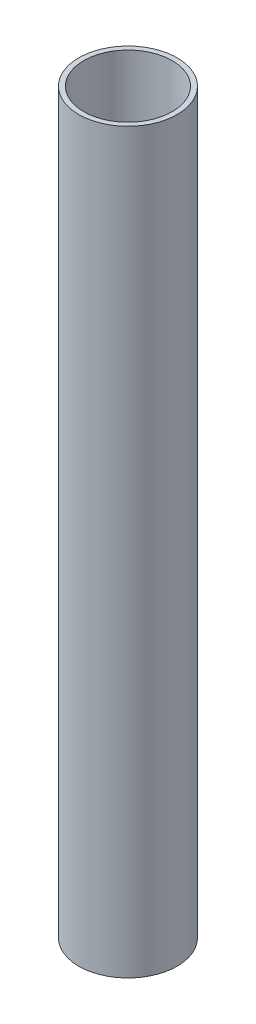
ISO-10303-21;
HEADER;
FILE_DESCRIPTION(('STEP AP214'),'2;1');
FILE_NAME('part.step','',(''),(''),'','','');
FILE_SCHEMA(('AUTOMOTIVE_DESIGN { 1 0 10303 214 1 1 1 1 }'));
ENDSEC;
DATA;
#1=APPLICATION_CONTEXT('core data for automotive mechanical design processes');
#2=APPLICATION_PROTOCOL_DEFINITION('international standard','automotive_design',2000,#1);
#3=PRODUCT_CONTEXT('',#1,'mechanical');
#4=PRODUCT('Part','Part','',(#3));
#5=PRODUCT_RELATED_PRODUCT_CATEGORY('part','',(#4));
#6=PRODUCT_DEFINITION_FORMATION('','',#4);
#7=PRODUCT_DEFINITION_CONTEXT('part definition',#1,'design');
#8=PRODUCT_DEFINITION('design','',#6,#7);
#9=PRODUCT_DEFINITION_SHAPE('','',#8);
#10=(LENGTH_UNIT() NAMED_UNIT(*) SI_UNIT(.MILLI.,.METRE.));
#11=(NAMED_UNIT(*) PLANE_ANGLE_UNIT() SI_UNIT($,.RADIAN.));
#12=(NAMED_UNIT(*) SI_UNIT($,.STERADIAN.) SOLID_ANGLE_UNIT());
#13=UNCERTAINTY_MEASURE_WITH_UNIT(LENGTH_MEASURE(1.E-05),#10,'distance_accuracy_value','');
#14=(GEOMETRIC_REPRESENTATION_CONTEXT(3) GLOBAL_UNCERTAINTY_ASSIGNED_CONTEXT((#13)) GLOBAL_UNIT_ASSIGNED_CONTEXT((#10,
#11,#12)) REPRESENTATION_CONTEXT('',''));
#15=CARTESIAN_POINT('',(0.,0.,0.));
#16=DIRECTION('',(0.,0.,1.));
#17=DIRECTION('',(1.,0.,0.));
#18=AXIS2_PLACEMENT_3D('',#15,#16,#17);
#19=CARTESIAN_POINT('',(0.,75.,0.));
#20=DIRECTION('',(0.,1.,0.));
#21=DIRECTION('',(0.,0.,1.));
#22=AXIS2_PLACEMENT_3D('',#19,#20,#21);
#23=PLANE('',#22);
#24=CARTESIAN_POINT('',(0.,75.,0.));
#25=DIRECTION('',(0.,1.,0.));
#26=DIRECTION('',(0.,0.,1.));
#27=AXIS2_PLACEMENT_3D('',#24,#25,#26);
#28=CIRCLE('',#27,10.);
#29=CARTESIAN_POINT('',(0.,75.,10.));
#30=VERTEX_POINT('',#29);
#31=EDGE_CURVE('E10',#30,#30,#28,.T.);
#32=ORIENTED_EDGE('',*,*,#31,.T.);
#33=EDGE_LOOP('',(#32));
#34=FACE_BOUND('',#33,.T.);
#35=CARTESIAN_POINT('',(0.,75.,0.));
#36=DIRECTION('',(0.,1.,0.));
#37=DIRECTION('',(0.,0.,1.));
#38=AXIS2_PLACEMENT_3D('',#35,#36,#37);
#39=CIRCLE('',#38,9.);
#40=CARTESIAN_POINT('',(0.,75.,9.));
#41=VERTEX_POINT('',#40);
#42=EDGE_CURVE('E46',#41,#41,#39,.T.);
#43=ORIENTED_EDGE('',*,*,#42,.F.);
#44=EDGE_LOOP('',(#43));
#45=FACE_BOUND('',#44,.T.);
#46=ADVANCED_FACE('F35',(#34,#45),#23,.T.);
#47=CARTESIAN_POINT('',(0.,-75.,0.));
#48=DIRECTION('',(0.,1.,0.));
#49=DIRECTION('',(0.,0.,1.));
#50=AXIS2_PLACEMENT_3D('',#47,#48,#49);
#51=PLANE('',#50);
#52=CARTESIAN_POINT('',(0.,-75.,0.));
#53=DIRECTION('',(0.,1.,0.));
#54=DIRECTION('',(0.,0.,1.));
#55=AXIS2_PLACEMENT_3D('',#52,#53,#54);
#56=CIRCLE('',#55,10.);
#57=CARTESIAN_POINT('',(0.,-75.,10.));
#58=VERTEX_POINT('',#57);
#59=EDGE_CURVE('E39',#58,#58,#56,.T.);
#60=ORIENTED_EDGE('',*,*,#59,.F.);
#61=EDGE_LOOP('',(#60));
#62=FACE_BOUND('',#61,.T.);
#63=CARTESIAN_POINT('',(0.,-75.,0.));
#64=DIRECTION('',(0.,1.,0.));
#65=DIRECTION('',(0.,0.,1.));
#66=AXIS2_PLACEMENT_3D('',#63,#64,#65);
#67=CIRCLE('',#66,9.);
#68=CARTESIAN_POINT('',(0.,-75.,9.));
#69=VERTEX_POINT('',#68);
#70=EDGE_CURVE('E48',#69,#69,#67,.T.);
#71=ORIENTED_EDGE('',*,*,#70,.T.);
#72=EDGE_LOOP('',(#71));
#73=FACE_BOUND('',#72,.T.);
#74=ADVANCED_FACE('F58',(#62,#73),#51,.F.);
#75=CARTESIAN_POINT('',(0.,75.,0.));
#76=DIRECTION('',(0.,-1.,0.));
#77=DIRECTION('',(0.,0.,-1.));
#78=AXIS2_PLACEMENT_3D('',#75,#76,#77);
#79=CYLINDRICAL_SURFACE('',#78,10.);
#80=ORIENTED_EDGE('',*,*,#31,.F.);
#81=EDGE_LOOP('',(#80));
#82=FACE_BOUND('',#81,.T.);
#83=ORIENTED_EDGE('',*,*,#59,.T.);
#84=EDGE_LOOP('',(#83));
#85=FACE_BOUND('',#84,.T.);
#86=ADVANCED_FACE('F37',(#82,#85),#79,.T.);
#87=CARTESIAN_POINT('',(0.,75.,0.));
#88=DIRECTION('',(0.,-1.,0.));
#89=DIRECTION('',(0.,0.,-1.));
#90=AXIS2_PLACEMENT_3D('',#87,#88,#89);
#91=CYLINDRICAL_SURFACE('',#90,9.);
#92=ORIENTED_EDGE('',*,*,#42,.T.);
#93=EDGE_LOOP('',(#92));
#94=FACE_BOUND('',#93,.T.);
#95=ORIENTED_EDGE('',*,*,#70,.F.);
#96=EDGE_LOOP('',(#95));
#97=FACE_BOUND('',#96,.T.);
#98=ADVANCED_FACE('F54',(#94,#97),#91,.F.);
#99=CLOSED_SHELL('',(#46,#74,#86,#98));
#100=MANIFOLD_SOLID_BREP('B2',#99);
#101=ADVANCED_BREP_SHAPE_REPRESENTATION('',(#18,#100),#14);
#102=SHAPE_DEFINITION_REPRESENTATION(#9,#101);
ENDSEC;
END-ISO-10303-21;
